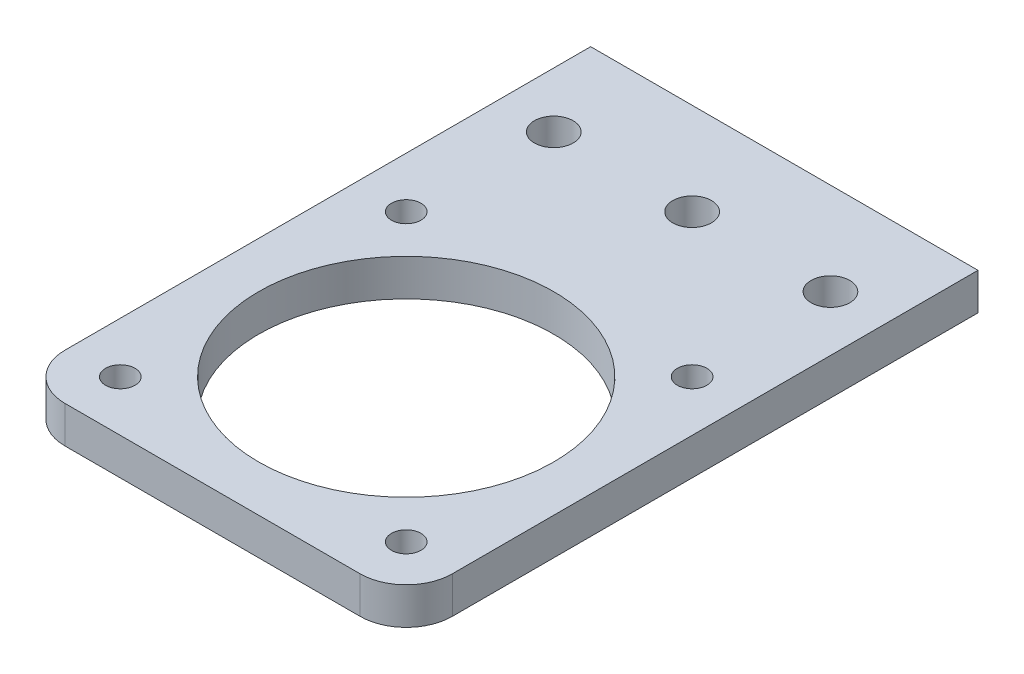
ISO-10303-21;
HEADER;
FILE_DESCRIPTION(('STEP AP214'),'2;1');
FILE_NAME('part.step','',(''),(''),'','','');
FILE_SCHEMA(('AUTOMOTIVE_DESIGN { 1 0 10303 214 1 1 1 1 }'));
ENDSEC;
DATA;
#1=APPLICATION_CONTEXT('core data for automotive mechanical design processes');
#2=APPLICATION_PROTOCOL_DEFINITION('international standard','automotive_design',2000,#1);
#3=PRODUCT_CONTEXT('',#1,'mechanical');
#4=PRODUCT('Part','Part','',(#3));
#5=PRODUCT_RELATED_PRODUCT_CATEGORY('part','',(#4));
#6=PRODUCT_DEFINITION_FORMATION('','',#4);
#7=PRODUCT_DEFINITION_CONTEXT('part definition',#1,'design');
#8=PRODUCT_DEFINITION('design','',#6,#7);
#9=PRODUCT_DEFINITION_SHAPE('','',#8);
#10=(LENGTH_UNIT() NAMED_UNIT(*) SI_UNIT(.MILLI.,.METRE.));
#11=(NAMED_UNIT(*) PLANE_ANGLE_UNIT() SI_UNIT($,.RADIAN.));
#12=(NAMED_UNIT(*) SI_UNIT($,.STERADIAN.) SOLID_ANGLE_UNIT());
#13=UNCERTAINTY_MEASURE_WITH_UNIT(LENGTH_MEASURE(1.E-05),#10,'distance_accuracy_value','');
#14=(GEOMETRIC_REPRESENTATION_CONTEXT(3) GLOBAL_UNCERTAINTY_ASSIGNED_CONTEXT((#13)) GLOBAL_UNIT_ASSIGNED_CONTEXT((#10,
#11,#12)) REPRESENTATION_CONTEXT('',''));
#15=CARTESIAN_POINT('',(0.,0.,0.));
#16=DIRECTION('',(0.,0.,1.));
#17=DIRECTION('',(1.,0.,0.));
#18=AXIS2_PLACEMENT_3D('',#15,#16,#17);
#19=CARTESIAN_POINT('',(5.00000000000001,4.,57.));
#20=DIRECTION('',(0.,1.,0.));
#21=DIRECTION('',(0.,0.,1.));
#22=AXIS2_PLACEMENT_3D('',#19,#20,#21);
#23=PLANE('',#22);
#24=CARTESIAN_POINT('',(36.,4.,10.));
#25=DIRECTION('',(0.,1.,0.));
#26=DIRECTION('',(0.,0.,1.));
#27=AXIS2_PLACEMENT_3D('',#24,#25,#26);
#28=CIRCLE('',#27,2.1);
#29=CARTESIAN_POINT('',(36.,4.,12.1));
#30=VERTEX_POINT('',#29);
#31=EDGE_CURVE('E215',#30,#30,#28,.T.);
#32=ORIENTED_EDGE('',*,*,#31,.F.);
#33=EDGE_LOOP('',(#32));
#34=FACE_BOUND('',#33,.T.);
#35=CARTESIAN_POINT('',(21.,4.,41.));
#36=DIRECTION('',(0.,1.,0.));
#37=DIRECTION('',(0.,0.,1.));
#38=AXIS2_PLACEMENT_3D('',#35,#36,#37);
#39=CIRCLE('',#38,16.);
#40=CARTESIAN_POINT('',(21.,4.,57.));
#41=VERTEX_POINT('',#40);
#42=EDGE_CURVE('E227',#41,#41,#39,.T.);
#43=ORIENTED_EDGE('',*,*,#42,.F.);
#44=EDGE_LOOP('',(#43));
#45=FACE_BOUND('',#44,.T.);
#46=CARTESIAN_POINT('',(36.5000000000003,4.,56.4999999999997));
#47=DIRECTION('',(0.,1.,0.));
#48=DIRECTION('',(0.,0.,1.));
#49=AXIS2_PLACEMENT_3D('',#46,#47,#48);
#50=CIRCLE('',#49,1.6);
#51=CARTESIAN_POINT('',(36.5000000000003,4.,58.0999999999997));
#52=VERTEX_POINT('',#51);
#53=EDGE_CURVE('E239',#52,#52,#50,.T.);
#54=ORIENTED_EDGE('',*,*,#53,.F.);
#55=EDGE_LOOP('',(#54));
#56=FACE_BOUND('',#55,.T.);
#57=CARTESIAN_POINT('',(5.5,4.,25.5));
#58=DIRECTION('',(0.,1.,0.));
#59=DIRECTION('',(0.,0.,1.));
#60=AXIS2_PLACEMENT_3D('',#57,#58,#59);
#61=CIRCLE('',#60,1.6);
#62=CARTESIAN_POINT('',(5.5,4.,27.1));
#63=VERTEX_POINT('',#62);
#64=EDGE_CURVE('E132',#63,#63,#61,.T.);
#65=ORIENTED_EDGE('',*,*,#64,.F.);
#66=EDGE_LOOP('',(#65));
#67=FACE_BOUND('',#66,.T.);
#68=DIRECTION('',(0.,0.,1.));
#69=VECTOR('',#68,1.);
#70=CARTESIAN_POINT('',(0.,4.,0.));
#71=LINE('',#70,#69);
#72=CARTESIAN_POINT('',(0.,4.,0.));
#73=VERTEX_POINT('',#72);
#74=CARTESIAN_POINT('',(0.,4.,57.));
#75=VERTEX_POINT('',#74);
#76=EDGE_CURVE('E139',#73,#75,#71,.T.);
#77=ORIENTED_EDGE('',*,*,#76,.T.);
#78=CARTESIAN_POINT('',(5.00000000000001,4.,57.));
#79=DIRECTION('',(0.,1.,0.));
#80=DIRECTION('',(0.,0.,1.));
#81=AXIS2_PLACEMENT_3D('',#78,#79,#80);
#82=CIRCLE('',#81,5.);
#83=CARTESIAN_POINT('',(5.00000000000004,4.,62.));
#84=VERTEX_POINT('',#83);
#85=EDGE_CURVE('E97',#75,#84,#82,.T.);
#86=ORIENTED_EDGE('',*,*,#85,.T.);
#87=DIRECTION('',(1.,0.,0.));
#88=VECTOR('',#87,1.);
#89=CARTESIAN_POINT('',(5.00000000000004,4.,62.));
#90=LINE('',#89,#88);
#91=CARTESIAN_POINT('',(37.,4.,62.));
#92=VERTEX_POINT('',#91);
#93=EDGE_CURVE('E110',#84,#92,#90,.T.);
#94=ORIENTED_EDGE('',*,*,#93,.T.);
#95=CARTESIAN_POINT('',(37.,4.,57.));
#96=DIRECTION('',(0.,1.,0.));
#97=DIRECTION('',(0.,0.,1.));
#98=AXIS2_PLACEMENT_3D('',#95,#96,#97);
#99=CIRCLE('',#98,5.);
#100=CARTESIAN_POINT('',(42.,4.,57.));
#101=VERTEX_POINT('',#100);
#102=EDGE_CURVE('E104',#92,#101,#99,.T.);
#103=ORIENTED_EDGE('',*,*,#102,.T.);
#104=DIRECTION('',(0.,0.,-1.));
#105=VECTOR('',#104,1.);
#106=CARTESIAN_POINT('',(42.,4.,0.));
#107=LINE('',#106,#105);
#108=CARTESIAN_POINT('',(42.,4.,0.));
#109=VERTEX_POINT('',#108);
#110=EDGE_CURVE('E108',#101,#109,#107,.T.);
#111=ORIENTED_EDGE('',*,*,#110,.T.);
#112=DIRECTION('',(-1.,0.,0.));
#113=VECTOR('',#112,1.);
#114=CARTESIAN_POINT('',(0.,4.,0.));
#115=LINE('',#114,#113);
#116=EDGE_CURVE('E60',#109,#73,#115,.T.);
#117=ORIENTED_EDGE('',*,*,#116,.T.);
#118=EDGE_LOOP('',(#77,#86,#94,#103,#111,#117));
#119=FACE_BOUND('',#118,.T.);
#120=CARTESIAN_POINT('',(36.5000000000001,4.,25.4999999999996));
#121=DIRECTION('',(0.,1.,0.));
#122=DIRECTION('',(0.,0.,1.));
#123=AXIS2_PLACEMENT_3D('',#120,#121,#122);
#124=CIRCLE('',#123,1.6);
#125=CARTESIAN_POINT('',(36.5000000000001,4.,27.0999999999996));
#126=VERTEX_POINT('',#125);
#127=EDGE_CURVE('E245',#126,#126,#124,.T.);
#128=ORIENTED_EDGE('',*,*,#127,.F.);
#129=EDGE_LOOP('',(#128));
#130=FACE_BOUND('',#129,.T.);
#131=CARTESIAN_POINT('',(5.50000000000028,4.,56.4999999999998));
#132=DIRECTION('',(0.,1.,0.));
#133=DIRECTION('',(0.,0.,1.));
#134=AXIS2_PLACEMENT_3D('',#131,#132,#133);
#135=CIRCLE('',#134,1.60000000000001);
#136=CARTESIAN_POINT('',(5.50000000000028,4.,58.0999999999998));
#137=VERTEX_POINT('',#136);
#138=EDGE_CURVE('E233',#137,#137,#135,.T.);
#139=ORIENTED_EDGE('',*,*,#138,.F.);
#140=EDGE_LOOP('',(#139));
#141=FACE_BOUND('',#140,.T.);
#142=CARTESIAN_POINT('',(21.,4.,10.));
#143=DIRECTION('',(0.,1.,0.));
#144=DIRECTION('',(0.,0.,1.));
#145=AXIS2_PLACEMENT_3D('',#142,#143,#144);
#146=CIRCLE('',#145,2.1);
#147=CARTESIAN_POINT('',(21.,4.,12.1));
#148=VERTEX_POINT('',#147);
#149=EDGE_CURVE('E221',#148,#148,#146,.T.);
#150=ORIENTED_EDGE('',*,*,#149,.F.);
#151=EDGE_LOOP('',(#150));
#152=FACE_BOUND('',#151,.T.);
#153=CARTESIAN_POINT('',(6.00000000000001,4.,10.));
#154=DIRECTION('',(0.,1.,0.));
#155=DIRECTION('',(0.,0.,1.));
#156=AXIS2_PLACEMENT_3D('',#153,#154,#155);
#157=CIRCLE('',#156,2.1);
#158=CARTESIAN_POINT('',(6.00000000000001,4.,12.1));
#159=VERTEX_POINT('',#158);
#160=EDGE_CURVE('E206',#159,#159,#157,.T.);
#161=ORIENTED_EDGE('',*,*,#160,.F.);
#162=EDGE_LOOP('',(#161));
#163=FACE_BOUND('',#162,.T.);
#164=ADVANCED_FACE('F43',(#34,#45,#56,#67,#119,#130,#141,#152,#163),#23,.T.);
#165=CARTESIAN_POINT('',(5.00000000000001,0.,57.));
#166=DIRECTION('',(0.,1.,0.));
#167=DIRECTION('',(0.,0.,1.));
#168=AXIS2_PLACEMENT_3D('',#165,#166,#167);
#169=PLANE('',#168);
#170=DIRECTION('',(0.,0.,1.));
#171=VECTOR('',#170,1.);
#172=CARTESIAN_POINT('',(0.,0.,0.));
#173=LINE('',#172,#171);
#174=CARTESIAN_POINT('',(0.,0.,0.));
#175=VERTEX_POINT('',#174);
#176=CARTESIAN_POINT('',(0.,0.,57.));
#177=VERTEX_POINT('',#176);
#178=EDGE_CURVE('E128',#175,#177,#173,.T.);
#179=ORIENTED_EDGE('',*,*,#178,.F.);
#180=DIRECTION('',(-1.,0.,0.));
#181=VECTOR('',#180,1.);
#182=CARTESIAN_POINT('',(0.,0.,0.));
#183=LINE('',#182,#181);
#184=CARTESIAN_POINT('',(42.,0.,0.));
#185=VERTEX_POINT('',#184);
#186=EDGE_CURVE('E89',#185,#175,#183,.T.);
#187=ORIENTED_EDGE('',*,*,#186,.F.);
#188=DIRECTION('',(0.,0.,-1.));
#189=VECTOR('',#188,1.);
#190=CARTESIAN_POINT('',(42.,0.,0.));
#191=LINE('',#190,#189);
#192=CARTESIAN_POINT('',(42.,0.,57.));
#193=VERTEX_POINT('',#192);
#194=EDGE_CURVE('E83',#193,#185,#191,.T.);
#195=ORIENTED_EDGE('',*,*,#194,.F.);
#196=CARTESIAN_POINT('',(37.,0.,57.));
#197=DIRECTION('',(0.,1.,0.));
#198=DIRECTION('',(0.,0.,1.));
#199=AXIS2_PLACEMENT_3D('',#196,#197,#198);
#200=CIRCLE('',#199,5.);
#201=CARTESIAN_POINT('',(37.,0.,62.));
#202=VERTEX_POINT('',#201);
#203=EDGE_CURVE('E118',#202,#193,#200,.T.);
#204=ORIENTED_EDGE('',*,*,#203,.F.);
#205=DIRECTION('',(1.,0.,0.));
#206=VECTOR('',#205,1.);
#207=CARTESIAN_POINT('',(5.00000000000004,0.,62.));
#208=LINE('',#207,#206);
#209=CARTESIAN_POINT('',(5.00000000000004,0.,62.));
#210=VERTEX_POINT('',#209);
#211=EDGE_CURVE('E134',#210,#202,#208,.T.);
#212=ORIENTED_EDGE('',*,*,#211,.F.);
#213=CARTESIAN_POINT('',(5.00000000000001,0.,57.));
#214=DIRECTION('',(0.,1.,0.));
#215=DIRECTION('',(0.,0.,1.));
#216=AXIS2_PLACEMENT_3D('',#213,#214,#215);
#217=CIRCLE('',#216,5.);
#218=EDGE_CURVE('E131',#177,#210,#217,.T.);
#219=ORIENTED_EDGE('',*,*,#218,.F.);
#220=EDGE_LOOP('',(#179,#187,#195,#204,#212,#219));
#221=FACE_BOUND('',#220,.T.);
#222=CARTESIAN_POINT('',(5.5,0.,25.5));
#223=DIRECTION('',(0.,1.,0.));
#224=DIRECTION('',(0.,0.,1.));
#225=AXIS2_PLACEMENT_3D('',#222,#223,#224);
#226=CIRCLE('',#225,1.6);
#227=CARTESIAN_POINT('',(5.5,0.,27.1));
#228=VERTEX_POINT('',#227);
#229=EDGE_CURVE('E248',#228,#228,#226,.T.);
#230=ORIENTED_EDGE('',*,*,#229,.T.);
#231=EDGE_LOOP('',(#230));
#232=FACE_BOUND('',#231,.T.);
#233=CARTESIAN_POINT('',(36.5000000000001,0.,25.4999999999996));
#234=DIRECTION('',(0.,1.,0.));
#235=DIRECTION('',(0.,0.,1.));
#236=AXIS2_PLACEMENT_3D('',#233,#234,#235);
#237=CIRCLE('',#236,1.6);
#238=CARTESIAN_POINT('',(36.5000000000001,0.,27.0999999999996));
#239=VERTEX_POINT('',#238);
#240=EDGE_CURVE('E242',#239,#239,#237,.T.);
#241=ORIENTED_EDGE('',*,*,#240,.T.);
#242=EDGE_LOOP('',(#241));
#243=FACE_BOUND('',#242,.T.);
#244=CARTESIAN_POINT('',(36.5000000000003,0.,56.4999999999997));
#245=DIRECTION('',(0.,1.,0.));
#246=DIRECTION('',(0.,0.,1.));
#247=AXIS2_PLACEMENT_3D('',#244,#245,#246);
#248=CIRCLE('',#247,1.6);
#249=CARTESIAN_POINT('',(36.5000000000003,0.,58.0999999999997));
#250=VERTEX_POINT('',#249);
#251=EDGE_CURVE('E236',#250,#250,#248,.T.);
#252=ORIENTED_EDGE('',*,*,#251,.T.);
#253=EDGE_LOOP('',(#252));
#254=FACE_BOUND('',#253,.T.);
#255=CARTESIAN_POINT('',(5.50000000000028,0.,56.4999999999998));
#256=DIRECTION('',(0.,1.,0.));
#257=DIRECTION('',(0.,0.,1.));
#258=AXIS2_PLACEMENT_3D('',#255,#256,#257);
#259=CIRCLE('',#258,1.60000000000001);
#260=CARTESIAN_POINT('',(5.50000000000028,0.,58.0999999999998));
#261=VERTEX_POINT('',#260);
#262=EDGE_CURVE('E230',#261,#261,#259,.T.);
#263=ORIENTED_EDGE('',*,*,#262,.T.);
#264=EDGE_LOOP('',(#263));
#265=FACE_BOUND('',#264,.T.);
#266=CARTESIAN_POINT('',(21.,0.,41.));
#267=DIRECTION('',(0.,1.,0.));
#268=DIRECTION('',(0.,0.,1.));
#269=AXIS2_PLACEMENT_3D('',#266,#267,#268);
#270=CIRCLE('',#269,16.);
#271=CARTESIAN_POINT('',(21.,0.,57.));
#272=VERTEX_POINT('',#271);
#273=EDGE_CURVE('E224',#272,#272,#270,.T.);
#274=ORIENTED_EDGE('',*,*,#273,.T.);
#275=EDGE_LOOP('',(#274));
#276=FACE_BOUND('',#275,.T.);
#277=CARTESIAN_POINT('',(21.,0.,10.));
#278=DIRECTION('',(0.,1.,0.));
#279=DIRECTION('',(0.,0.,1.));
#280=AXIS2_PLACEMENT_3D('',#277,#278,#279);
#281=CIRCLE('',#280,2.1);
#282=CARTESIAN_POINT('',(21.,0.,12.1));
#283=VERTEX_POINT('',#282);
#284=EDGE_CURVE('E218',#283,#283,#281,.T.);
#285=ORIENTED_EDGE('',*,*,#284,.T.);
#286=EDGE_LOOP('',(#285));
#287=FACE_BOUND('',#286,.T.);
#288=CARTESIAN_POINT('',(36.,0.,10.));
#289=DIRECTION('',(0.,1.,0.));
#290=DIRECTION('',(0.,0.,1.));
#291=AXIS2_PLACEMENT_3D('',#288,#289,#290);
#292=CIRCLE('',#291,2.1);
#293=CARTESIAN_POINT('',(36.,0.,12.1));
#294=VERTEX_POINT('',#293);
#295=EDGE_CURVE('E212',#294,#294,#292,.T.);
#296=ORIENTED_EDGE('',*,*,#295,.T.);
#297=EDGE_LOOP('',(#296));
#298=FACE_BOUND('',#297,.T.);
#299=CARTESIAN_POINT('',(6.00000000000001,0.,10.));
#300=DIRECTION('',(0.,1.,0.));
#301=DIRECTION('',(0.,0.,1.));
#302=AXIS2_PLACEMENT_3D('',#299,#300,#301);
#303=CIRCLE('',#302,2.1);
#304=CARTESIAN_POINT('',(6.00000000000001,0.,12.1));
#305=VERTEX_POINT('',#304);
#306=EDGE_CURVE('E209',#305,#305,#303,.T.);
#307=ORIENTED_EDGE('',*,*,#306,.T.);
#308=EDGE_LOOP('',(#307));
#309=FACE_BOUND('',#308,.T.);
#310=ADVANCED_FACE('F148',(#221,#232,#243,#254,#265,#276,#287,#298,#309),#169,.F.);
#311=CARTESIAN_POINT('',(0.,4.,0.));
#312=DIRECTION('',(1.,0.,0.));
#313=DIRECTION('',(0.,0.,-1.));
#314=AXIS2_PLACEMENT_3D('',#311,#312,#313);
#315=PLANE('',#314);
#316=ORIENTED_EDGE('',*,*,#178,.T.);
#317=DIRECTION('',(0.,-1.,0.));
#318=VECTOR('',#317,1.);
#319=CARTESIAN_POINT('',(0.,4.,57.));
#320=LINE('',#319,#318);
#321=EDGE_CURVE('E11',#75,#177,#320,.T.);
#322=ORIENTED_EDGE('',*,*,#321,.F.);
#323=ORIENTED_EDGE('',*,*,#76,.F.);
#324=DIRECTION('',(0.,-1.,0.));
#325=VECTOR('',#324,1.);
#326=CARTESIAN_POINT('',(0.,4.,0.));
#327=LINE('',#326,#325);
#328=EDGE_CURVE('E124',#73,#175,#327,.T.);
#329=ORIENTED_EDGE('',*,*,#328,.T.);
#330=EDGE_LOOP('',(#316,#322,#323,#329));
#331=FACE_BOUND('',#330,.T.);
#332=ADVANCED_FACE('F45',(#331),#315,.F.);
#333=CARTESIAN_POINT('',(5.00000000000001,4.,57.));
#334=DIRECTION('',(0.,-1.,0.));
#335=DIRECTION('',(0.,0.,-1.));
#336=AXIS2_PLACEMENT_3D('',#333,#334,#335);
#337=CYLINDRICAL_SURFACE('',#336,5.);
#338=ORIENTED_EDGE('',*,*,#218,.T.);
#339=DIRECTION('',(0.,-1.,0.));
#340=VECTOR('',#339,1.);
#341=CARTESIAN_POINT('',(5.00000000000004,4.,62.));
#342=LINE('',#341,#340);
#343=EDGE_CURVE('E52',#84,#210,#342,.T.);
#344=ORIENTED_EDGE('',*,*,#343,.F.);
#345=ORIENTED_EDGE('',*,*,#85,.F.);
#346=ORIENTED_EDGE('',*,*,#321,.T.);
#347=EDGE_LOOP('',(#338,#344,#345,#346));
#348=FACE_BOUND('',#347,.T.);
#349=ADVANCED_FACE('F346',(#348),#337,.T.);
#350=CARTESIAN_POINT('',(5.00000000000004,4.,62.));
#351=DIRECTION('',(0.,0.,-1.));
#352=DIRECTION('',(-1.,0.,0.));
#353=AXIS2_PLACEMENT_3D('',#350,#351,#352);
#354=PLANE('',#353);
#355=ORIENTED_EDGE('',*,*,#211,.T.);
#356=DIRECTION('',(0.,-1.,0.));
#357=VECTOR('',#356,1.);
#358=CARTESIAN_POINT('',(37.,4.,62.));
#359=LINE('',#358,#357);
#360=EDGE_CURVE('E119',#92,#202,#359,.T.);
#361=ORIENTED_EDGE('',*,*,#360,.F.);
#362=ORIENTED_EDGE('',*,*,#93,.F.);
#363=ORIENTED_EDGE('',*,*,#343,.T.);
#364=EDGE_LOOP('',(#355,#361,#362,#363));
#365=FACE_BOUND('',#364,.T.);
#366=ADVANCED_FACE('F145',(#365),#354,.F.);
#367=CARTESIAN_POINT('',(37.,4.,57.));
#368=DIRECTION('',(0.,-1.,0.));
#369=DIRECTION('',(0.,0.,-1.));
#370=AXIS2_PLACEMENT_3D('',#367,#368,#369);
#371=CYLINDRICAL_SURFACE('',#370,5.);
#372=ORIENTED_EDGE('',*,*,#203,.T.);
#373=DIRECTION('',(0.,-1.,0.));
#374=VECTOR('',#373,1.);
#375=CARTESIAN_POINT('',(42.,4.,57.));
#376=LINE('',#375,#374);
#377=EDGE_CURVE('E115',#101,#193,#376,.T.);
#378=ORIENTED_EDGE('',*,*,#377,.F.);
#379=ORIENTED_EDGE('',*,*,#102,.F.);
#380=ORIENTED_EDGE('',*,*,#360,.T.);
#381=EDGE_LOOP('',(#372,#378,#379,#380));
#382=FACE_BOUND('',#381,.T.);
#383=ADVANCED_FACE('F116',(#382),#371,.T.);
#384=CARTESIAN_POINT('',(42.,4.,0.));
#385=DIRECTION('',(-1.,0.,0.));
#386=DIRECTION('',(0.,0.,1.));
#387=AXIS2_PLACEMENT_3D('',#384,#385,#386);
#388=PLANE('',#387);
#389=ORIENTED_EDGE('',*,*,#194,.T.);
#390=DIRECTION('',(0.,-1.,0.));
#391=VECTOR('',#390,1.);
#392=CARTESIAN_POINT('',(42.,4.,0.));
#393=LINE('',#392,#391);
#394=EDGE_CURVE('E120',#109,#185,#393,.T.);
#395=ORIENTED_EDGE('',*,*,#394,.F.);
#396=ORIENTED_EDGE('',*,*,#110,.F.);
#397=ORIENTED_EDGE('',*,*,#377,.T.);
#398=EDGE_LOOP('',(#389,#395,#396,#397));
#399=FACE_BOUND('',#398,.T.);
#400=ADVANCED_FACE('F122',(#399),#388,.F.);
#401=CARTESIAN_POINT('',(0.,4.,0.));
#402=DIRECTION('',(0.,0.,1.));
#403=DIRECTION('',(1.,0.,0.));
#404=AXIS2_PLACEMENT_3D('',#401,#402,#403);
#405=PLANE('',#404);
#406=ORIENTED_EDGE('',*,*,#186,.T.);
#407=ORIENTED_EDGE('',*,*,#328,.F.);
#408=ORIENTED_EDGE('',*,*,#116,.F.);
#409=ORIENTED_EDGE('',*,*,#394,.T.);
#410=EDGE_LOOP('',(#406,#407,#408,#409));
#411=FACE_BOUND('',#410,.T.);
#412=ADVANCED_FACE('F153',(#411),#405,.F.);
#413=CARTESIAN_POINT('',(5.5,4.,25.5));
#414=DIRECTION('',(0.,-1.,0.));
#415=DIRECTION('',(0.,0.,-1.));
#416=AXIS2_PLACEMENT_3D('',#413,#414,#415);
#417=CYLINDRICAL_SURFACE('',#416,1.6);
#418=ORIENTED_EDGE('',*,*,#64,.T.);
#419=EDGE_LOOP('',(#418));
#420=FACE_BOUND('',#419,.T.);
#421=ORIENTED_EDGE('',*,*,#229,.F.);
#422=EDGE_LOOP('',(#421));
#423=FACE_BOUND('',#422,.T.);
#424=ADVANCED_FACE('F155',(#420,#423),#417,.F.);
#425=CARTESIAN_POINT('',(36.5000000000001,4.,25.4999999999996));
#426=DIRECTION('',(0.,-1.,0.));
#427=DIRECTION('',(0.,0.,-1.));
#428=AXIS2_PLACEMENT_3D('',#425,#426,#427);
#429=CYLINDRICAL_SURFACE('',#428,1.6);
#430=ORIENTED_EDGE('',*,*,#127,.T.);
#431=EDGE_LOOP('',(#430));
#432=FACE_BOUND('',#431,.T.);
#433=ORIENTED_EDGE('',*,*,#240,.F.);
#434=EDGE_LOOP('',(#433));
#435=FACE_BOUND('',#434,.T.);
#436=ADVANCED_FACE('F161',(#432,#435),#429,.F.);
#437=CARTESIAN_POINT('',(36.5000000000003,4.,56.4999999999997));
#438=DIRECTION('',(0.,-1.,0.));
#439=DIRECTION('',(0.,0.,-1.));
#440=AXIS2_PLACEMENT_3D('',#437,#438,#439);
#441=CYLINDRICAL_SURFACE('',#440,1.6);
#442=ORIENTED_EDGE('',*,*,#53,.T.);
#443=EDGE_LOOP('',(#442));
#444=FACE_BOUND('',#443,.T.);
#445=ORIENTED_EDGE('',*,*,#251,.F.);
#446=EDGE_LOOP('',(#445));
#447=FACE_BOUND('',#446,.T.);
#448=ADVANCED_FACE('F177',(#444,#447),#441,.F.);
#449=CARTESIAN_POINT('',(5.50000000000028,4.,56.4999999999998));
#450=DIRECTION('',(0.,-1.,0.));
#451=DIRECTION('',(0.,0.,-1.));
#452=AXIS2_PLACEMENT_3D('',#449,#450,#451);
#453=CYLINDRICAL_SURFACE('',#452,1.60000000000001);
#454=ORIENTED_EDGE('',*,*,#138,.T.);
#455=EDGE_LOOP('',(#454));
#456=FACE_BOUND('',#455,.T.);
#457=ORIENTED_EDGE('',*,*,#262,.F.);
#458=EDGE_LOOP('',(#457));
#459=FACE_BOUND('',#458,.T.);
#460=ADVANCED_FACE('F181',(#456,#459),#453,.F.);
#461=CARTESIAN_POINT('',(21.,4.,41.));
#462=DIRECTION('',(0.,-1.,0.));
#463=DIRECTION('',(0.,0.,-1.));
#464=AXIS2_PLACEMENT_3D('',#461,#462,#463);
#465=CYLINDRICAL_SURFACE('',#464,16.);
#466=ORIENTED_EDGE('',*,*,#42,.T.);
#467=EDGE_LOOP('',(#466));
#468=FACE_BOUND('',#467,.T.);
#469=ORIENTED_EDGE('',*,*,#273,.F.);
#470=EDGE_LOOP('',(#469));
#471=FACE_BOUND('',#470,.T.);
#472=ADVANCED_FACE('F185',(#468,#471),#465,.F.);
#473=CARTESIAN_POINT('',(21.,4.,10.));
#474=DIRECTION('',(0.,-1.,0.));
#475=DIRECTION('',(0.,0.,-1.));
#476=AXIS2_PLACEMENT_3D('',#473,#474,#475);
#477=CYLINDRICAL_SURFACE('',#476,2.1);
#478=ORIENTED_EDGE('',*,*,#149,.T.);
#479=EDGE_LOOP('',(#478));
#480=FACE_BOUND('',#479,.T.);
#481=ORIENTED_EDGE('',*,*,#284,.F.);
#482=EDGE_LOOP('',(#481));
#483=FACE_BOUND('',#482,.T.);
#484=ADVANCED_FACE('F189',(#480,#483),#477,.F.);
#485=CARTESIAN_POINT('',(36.,4.,10.));
#486=DIRECTION('',(0.,-1.,0.));
#487=DIRECTION('',(0.,0.,-1.));
#488=AXIS2_PLACEMENT_3D('',#485,#486,#487);
#489=CYLINDRICAL_SURFACE('',#488,2.1);
#490=ORIENTED_EDGE('',*,*,#31,.T.);
#491=EDGE_LOOP('',(#490));
#492=FACE_BOUND('',#491,.T.);
#493=ORIENTED_EDGE('',*,*,#295,.F.);
#494=EDGE_LOOP('',(#493));
#495=FACE_BOUND('',#494,.T.);
#496=ADVANCED_FACE('F193',(#492,#495),#489,.F.);
#497=CARTESIAN_POINT('',(6.00000000000001,4.,10.));
#498=DIRECTION('',(0.,-1.,0.));
#499=DIRECTION('',(0.,0.,-1.));
#500=AXIS2_PLACEMENT_3D('',#497,#498,#499);
#501=CYLINDRICAL_SURFACE('',#500,2.1);
#502=ORIENTED_EDGE('',*,*,#160,.T.);
#503=EDGE_LOOP('',(#502));
#504=FACE_BOUND('',#503,.T.);
#505=ORIENTED_EDGE('',*,*,#306,.F.);
#506=EDGE_LOOP('',(#505));
#507=FACE_BOUND('',#506,.T.);
#508=ADVANCED_FACE('F197',(#504,#507),#501,.F.);
#509=CLOSED_SHELL('',(#164,#310,#332,#349,#366,#383,#400,#412,#424,#436,#448,#460,#472,#484,
#496,#508));
#510=MANIFOLD_SOLID_BREP('B2',#509);
#511=ADVANCED_BREP_SHAPE_REPRESENTATION('',(#18,#510),#14);
#512=SHAPE_DEFINITION_REPRESENTATION(#9,#511);
ENDSEC;
END-ISO-10303-21;
